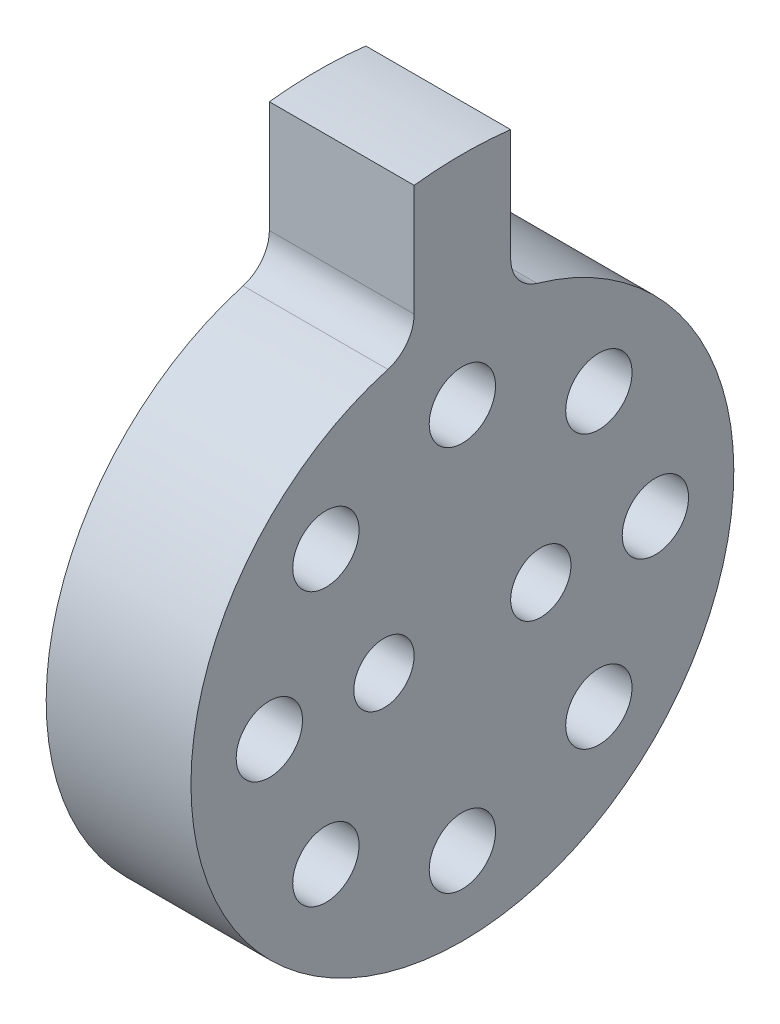
ISO-10303-21;
HEADER;
FILE_DESCRIPTION(('STEP AP214'),'2;1');
FILE_NAME('part.step','',(''),(''),'','','');
FILE_SCHEMA(('AUTOMOTIVE_DESIGN { 1 0 10303 214 1 1 1 1 }'));
ENDSEC;
DATA;
#1=APPLICATION_CONTEXT('core data for automotive mechanical design processes');
#2=APPLICATION_PROTOCOL_DEFINITION('international standard','automotive_design',2000,#1);
#3=PRODUCT_CONTEXT('',#1,'mechanical');
#4=PRODUCT('Part','Part','',(#3));
#5=PRODUCT_RELATED_PRODUCT_CATEGORY('part','',(#4));
#6=PRODUCT_DEFINITION_FORMATION('','',#4);
#7=PRODUCT_DEFINITION_CONTEXT('part definition',#1,'design');
#8=PRODUCT_DEFINITION('design','',#6,#7);
#9=PRODUCT_DEFINITION_SHAPE('','',#8);
#10=(LENGTH_UNIT() NAMED_UNIT(*) SI_UNIT(.MILLI.,.METRE.));
#11=(NAMED_UNIT(*) PLANE_ANGLE_UNIT() SI_UNIT($,.RADIAN.));
#12=(NAMED_UNIT(*) SI_UNIT($,.STERADIAN.) SOLID_ANGLE_UNIT());
#13=UNCERTAINTY_MEASURE_WITH_UNIT(LENGTH_MEASURE(1.E-05),#10,'distance_accuracy_value','');
#14=(GEOMETRIC_REPRESENTATION_CONTEXT(3) GLOBAL_UNCERTAINTY_ASSIGNED_CONTEXT((#13)) GLOBAL_UNIT_ASSIGNED_CONTEXT((#10,
#11,#12)) REPRESENTATION_CONTEXT('',''));
#15=CARTESIAN_POINT('',(0.,0.,0.));
#16=DIRECTION('',(0.,0.,1.));
#17=DIRECTION('',(1.,0.,0.));
#18=AXIS2_PLACEMENT_3D('',#15,#16,#17);
#19=CARTESIAN_POINT('',(12.,0.,0.));
#20=DIRECTION('',(-1.,0.,0.));
#21=DIRECTION('',(0.,0.,1.));
#22=AXIS2_PLACEMENT_3D('',#19,#20,#21);
#23=CYLINDRICAL_SURFACE('',#22,34.);
#24=DIRECTION('',(-1.,0.,0.));
#25=VECTOR('',#24,1.);
#26=CARTESIAN_POINT('',(12.,33.7638860322683,4.));
#27=LINE('',#26,#25);
#28=CARTESIAN_POINT('',(12.,33.7638860322683,4.));
#29=VERTEX_POINT('',#28);
#30=CARTESIAN_POINT('',(0.,33.7638860322683,4.));
#31=VERTEX_POINT('',#30);
#32=EDGE_CURVE('E103',#29,#31,#27,.T.);
#33=ORIENTED_EDGE('',*,*,#32,.F.);
#34=CARTESIAN_POINT('',(12.,0.,0.));
#35=DIRECTION('',(1.,0.,0.));
#36=DIRECTION('',(0.,0.,-1.));
#37=AXIS2_PLACEMENT_3D('',#34,#35,#36);
#38=CIRCLE('',#37,34.);
#39=CARTESIAN_POINT('',(12.,33.7638860322683,-4.));
#40=VERTEX_POINT('',#39);
#41=EDGE_CURVE('E109',#40,#29,#38,.T.);
#42=ORIENTED_EDGE('',*,*,#41,.F.);
#43=DIRECTION('',(-1.,0.,0.));
#44=VECTOR('',#43,1.);
#45=CARTESIAN_POINT('',(12.,33.7638860322683,-4.));
#46=LINE('',#45,#44);
#47=CARTESIAN_POINT('',(0.,33.7638860322683,-4.));
#48=VERTEX_POINT('',#47);
#49=EDGE_CURVE('E91',#40,#48,#46,.T.);
#50=ORIENTED_EDGE('',*,*,#49,.T.);
#51=CARTESIAN_POINT('',(0.,0.,0.));
#52=DIRECTION('',(1.,0.,0.));
#53=DIRECTION('',(0.,0.,-1.));
#54=AXIS2_PLACEMENT_3D('',#51,#52,#53);
#55=CIRCLE('',#54,34.);
#56=EDGE_CURVE('E119',#48,#31,#55,.T.);
#57=ORIENTED_EDGE('',*,*,#56,.T.);
#58=EDGE_LOOP('',(#33,#42,#50,#57));
#59=FACE_BOUND('',#58,.T.);
#60=ADVANCED_FACE('F40',(#59),#23,.T.);
#61=CARTESIAN_POINT('',(12.,0.,0.));
#62=DIRECTION('',(1.,0.,0.));
#63=DIRECTION('',(0.,0.,-1.));
#64=AXIS2_PLACEMENT_3D('',#61,#62,#63);
#65=PLANE('',#64);
#66=CARTESIAN_POINT('',(12.,0.,6.5));
#67=DIRECTION('',(-1.,0.,0.));
#68=DIRECTION('',(0.,0.,1.));
#69=AXIS2_PLACEMENT_3D('',#66,#67,#68);
#70=CIRCLE('',#69,2.5);
#71=CARTESIAN_POINT('',(12.,0.,9.));
#72=VERTEX_POINT('',#71);
#73=EDGE_CURVE('E282',#72,#72,#70,.T.);
#74=ORIENTED_EDGE('',*,*,#73,.T.);
#75=EDGE_LOOP('',(#74));
#76=FACE_BOUND('',#75,.T.);
#77=CARTESIAN_POINT('',(12.,0.,-6.5));
#78=DIRECTION('',(-1.,0.,0.));
#79=DIRECTION('',(0.,0.,1.));
#80=AXIS2_PLACEMENT_3D('',#77,#78,#79);
#81=CIRCLE('',#80,2.5);
#82=CARTESIAN_POINT('',(12.,0.,-4.));
#83=VERTEX_POINT('',#82);
#84=EDGE_CURVE('E277',#83,#83,#81,.T.);
#85=ORIENTED_EDGE('',*,*,#84,.T.);
#86=EDGE_LOOP('',(#85));
#87=FACE_BOUND('',#86,.T.);
#88=CARTESIAN_POINT('',(12.,16.,0.));
#89=DIRECTION('',(-1.,0.,0.));
#90=DIRECTION('',(0.,0.,1.));
#91=AXIS2_PLACEMENT_3D('',#88,#89,#90);
#92=CIRCLE('',#91,2.75);
#93=CARTESIAN_POINT('',(12.,16.,2.75));
#94=VERTEX_POINT('',#93);
#95=EDGE_CURVE('E123',#94,#94,#92,.T.);
#96=ORIENTED_EDGE('',*,*,#95,.T.);
#97=EDGE_LOOP('',(#96));
#98=FACE_BOUND('',#97,.T.);
#99=CARTESIAN_POINT('',(12.,11.3137084989847,-11.3137084989848));
#100=DIRECTION('',(-1.,0.,0.));
#101=DIRECTION('',(0.,0.,1.));
#102=AXIS2_PLACEMENT_3D('',#99,#100,#101);
#103=CIRCLE('',#102,2.75);
#104=CARTESIAN_POINT('',(12.,11.3137084989847,-8.56370849898478));
#105=VERTEX_POINT('',#104);
#106=EDGE_CURVE('E376',#105,#105,#103,.T.);
#107=ORIENTED_EDGE('',*,*,#106,.T.);
#108=EDGE_LOOP('',(#107));
#109=FACE_BOUND('',#108,.T.);
#110=CARTESIAN_POINT('',(12.,0.,-16.));
#111=DIRECTION('',(-1.,0.,0.));
#112=DIRECTION('',(0.,0.,1.));
#113=AXIS2_PLACEMENT_3D('',#110,#111,#112);
#114=CIRCLE('',#113,2.75);
#115=CARTESIAN_POINT('',(12.,0.,-13.25));
#116=VERTEX_POINT('',#115);
#117=EDGE_CURVE('E364',#116,#116,#114,.T.);
#118=ORIENTED_EDGE('',*,*,#117,.T.);
#119=EDGE_LOOP('',(#118));
#120=FACE_BOUND('',#119,.T.);
#121=CARTESIAN_POINT('',(12.,-11.3137084989848,-11.3137084989847));
#122=DIRECTION('',(-1.,0.,0.));
#123=DIRECTION('',(0.,0.,1.));
#124=AXIS2_PLACEMENT_3D('',#121,#122,#123);
#125=CIRCLE('',#124,2.75);
#126=CARTESIAN_POINT('',(12.,-11.3137084989848,-8.5637084989847));
#127=VERTEX_POINT('',#126);
#128=EDGE_CURVE('E352',#127,#127,#125,.T.);
#129=ORIENTED_EDGE('',*,*,#128,.T.);
#130=EDGE_LOOP('',(#129));
#131=FACE_BOUND('',#130,.T.);
#132=CARTESIAN_POINT('',(12.,-16.,0.));
#133=DIRECTION('',(-1.,0.,0.));
#134=DIRECTION('',(0.,0.,1.));
#135=AXIS2_PLACEMENT_3D('',#132,#133,#134);
#136=CIRCLE('',#135,2.75);
#137=CARTESIAN_POINT('',(12.,-16.,2.75));
#138=VERTEX_POINT('',#137);
#139=EDGE_CURVE('E340',#138,#138,#136,.T.);
#140=ORIENTED_EDGE('',*,*,#139,.T.);
#141=EDGE_LOOP('',(#140));
#142=FACE_BOUND('',#141,.T.);
#143=CARTESIAN_POINT('',(12.,-11.3137084989847,11.3137084989849));
#144=DIRECTION('',(-1.,0.,0.));
#145=DIRECTION('',(0.,0.,1.));
#146=AXIS2_PLACEMENT_3D('',#143,#144,#145);
#147=CIRCLE('',#146,2.75);
#148=CARTESIAN_POINT('',(12.,-11.3137084989847,14.0637084989849));
#149=VERTEX_POINT('',#148);
#150=EDGE_CURVE('E328',#149,#149,#147,.T.);
#151=ORIENTED_EDGE('',*,*,#150,.T.);
#152=EDGE_LOOP('',(#151));
#153=FACE_BOUND('',#152,.T.);
#154=CARTESIAN_POINT('',(12.,1.6759120133325E-13,16.));
#155=DIRECTION('',(-1.,0.,0.));
#156=DIRECTION('',(0.,0.,1.));
#157=AXIS2_PLACEMENT_3D('',#154,#155,#156);
#158=CIRCLE('',#157,2.75);
#159=CARTESIAN_POINT('',(12.,1.6759120133325E-13,18.75));
#160=VERTEX_POINT('',#159);
#161=EDGE_CURVE('E316',#160,#160,#158,.T.);
#162=ORIENTED_EDGE('',*,*,#161,.T.);
#163=EDGE_LOOP('',(#162));
#164=FACE_BOUND('',#163,.T.);
#165=CARTESIAN_POINT('',(12.,11.3137084989849,11.3137084989846));
#166=DIRECTION('',(-1.,0.,0.));
#167=DIRECTION('',(0.,0.,1.));
#168=AXIS2_PLACEMENT_3D('',#165,#166,#167);
#169=CIRCLE('',#168,2.75);
#170=CARTESIAN_POINT('',(12.,11.3137084989849,14.0637084989846));
#171=VERTEX_POINT('',#170);
#172=EDGE_CURVE('E304',#171,#171,#169,.T.);
#173=ORIENTED_EDGE('',*,*,#172,.T.);
#174=EDGE_LOOP('',(#173));
#175=FACE_BOUND('',#174,.T.);
#176=ORIENTED_EDGE('',*,*,#41,.T.);
#177=DIRECTION('',(0.,1.,0.));
#178=VECTOR('',#177,1.);
#179=CARTESIAN_POINT('',(12.,33.7638860322683,4.));
#180=LINE('',#179,#178);
#181=CARTESIAN_POINT('',(12.,24.5203996704785,4.));
#182=VERTEX_POINT('',#181);
#183=EDGE_CURVE('E104',#182,#29,#180,.T.);
#184=ORIENTED_EDGE('',*,*,#183,.F.);
#185=CARTESIAN_POINT('',(12.,24.5203996704785,7.));
#186=DIRECTION('',(1.,0.,0.));
#187=DIRECTION('',(0.,0.,-1.));
#188=AXIS2_PLACEMENT_3D('',#185,#186,#187);
#189=CIRCLE('',#188,3.);
#190=CARTESIAN_POINT('',(12.,21.6356467680692,6.17647058823529));
#191=VERTEX_POINT('',#190);
#192=EDGE_CURVE('E12',#182,#191,#189,.F.);
#193=ORIENTED_EDGE('',*,*,#192,.T.);
#194=CARTESIAN_POINT('',(12.,0.,0.));
#195=DIRECTION('',(-1.,0.,0.));
#196=DIRECTION('',(0.,0.,1.));
#197=AXIS2_PLACEMENT_3D('',#194,#195,#196);
#198=CIRCLE('',#197,22.5);
#199=CARTESIAN_POINT('',(12.,21.6356467680692,-6.17647058823529));
#200=VERTEX_POINT('',#199);
#201=EDGE_CURVE('E113',#200,#191,#198,.T.);
#202=ORIENTED_EDGE('',*,*,#201,.F.);
#203=CARTESIAN_POINT('',(12.,24.5203996704785,-7.));
#204=DIRECTION('',(1.,0.,0.));
#205=DIRECTION('',(0.,0.,-1.));
#206=AXIS2_PLACEMENT_3D('',#203,#204,#205);
#207=CIRCLE('',#206,3.);
#208=CARTESIAN_POINT('',(12.,24.5203996704785,-4.));
#209=VERTEX_POINT('',#208);
#210=EDGE_CURVE('E112',#200,#209,#207,.F.);
#211=ORIENTED_EDGE('',*,*,#210,.T.);
#212=DIRECTION('',(0.,-1.,0.));
#213=VECTOR('',#212,1.);
#214=CARTESIAN_POINT('',(12.,33.7638860322683,-4.));
#215=LINE('',#214,#213);
#216=EDGE_CURVE('E95',#40,#209,#215,.T.);
#217=ORIENTED_EDGE('',*,*,#216,.F.);
#218=EDGE_LOOP('',(#176,#184,#193,#202,#211,#217));
#219=FACE_BOUND('',#218,.T.);
#220=ADVANCED_FACE('F108',(#76,#87,#98,#109,#120,#131,#142,#153,#164,#175,#219),#65,.T.);
#221=CARTESIAN_POINT('',(0.,0.,0.));
#222=DIRECTION('',(1.,0.,0.));
#223=DIRECTION('',(0.,0.,-1.));
#224=AXIS2_PLACEMENT_3D('',#221,#222,#223);
#225=PLANE('',#224);
#226=CARTESIAN_POINT('',(0.,0.,6.5));
#227=DIRECTION('',(-1.,0.,0.));
#228=DIRECTION('',(0.,0.,1.));
#229=AXIS2_PLACEMENT_3D('',#226,#227,#228);
#230=CIRCLE('',#229,2.5);
#231=CARTESIAN_POINT('',(0.,0.,9.));
#232=VERTEX_POINT('',#231);
#233=EDGE_CURVE('E286',#232,#232,#230,.T.);
#234=ORIENTED_EDGE('',*,*,#233,.F.);
#235=EDGE_LOOP('',(#234));
#236=FACE_BOUND('',#235,.T.);
#237=CARTESIAN_POINT('',(0.,0.,-6.5));
#238=DIRECTION('',(-1.,0.,0.));
#239=DIRECTION('',(0.,0.,1.));
#240=AXIS2_PLACEMENT_3D('',#237,#238,#239);
#241=CIRCLE('',#240,2.5);
#242=CARTESIAN_POINT('',(0.,0.,-4.));
#243=VERTEX_POINT('',#242);
#244=EDGE_CURVE('E280',#243,#243,#241,.T.);
#245=ORIENTED_EDGE('',*,*,#244,.F.);
#246=EDGE_LOOP('',(#245));
#247=FACE_BOUND('',#246,.T.);
#248=CARTESIAN_POINT('',(0.,16.,0.));
#249=DIRECTION('',(-1.,0.,0.));
#250=DIRECTION('',(0.,0.,1.));
#251=AXIS2_PLACEMENT_3D('',#248,#249,#250);
#252=CIRCLE('',#251,5.);
#253=CARTESIAN_POINT('',(0.,16.,5.));
#254=VERTEX_POINT('',#253);
#255=EDGE_CURVE('E379',#254,#254,#252,.T.);
#256=ORIENTED_EDGE('',*,*,#255,.F.);
#257=EDGE_LOOP('',(#256));
#258=FACE_BOUND('',#257,.T.);
#259=CARTESIAN_POINT('',(0.,11.3137084989847,-11.3137084989848));
#260=DIRECTION('',(-1.,0.,0.));
#261=DIRECTION('',(0.,0.,1.));
#262=AXIS2_PLACEMENT_3D('',#259,#260,#261);
#263=CIRCLE('',#262,5.);
#264=CARTESIAN_POINT('',(0.,11.3137084989847,-6.31370849898478));
#265=VERTEX_POINT('',#264);
#266=EDGE_CURVE('E367',#265,#265,#263,.T.);
#267=ORIENTED_EDGE('',*,*,#266,.F.);
#268=EDGE_LOOP('',(#267));
#269=FACE_BOUND('',#268,.T.);
#270=CARTESIAN_POINT('',(0.,0.,-16.));
#271=DIRECTION('',(-1.,0.,0.));
#272=DIRECTION('',(0.,0.,1.));
#273=AXIS2_PLACEMENT_3D('',#270,#271,#272);
#274=CIRCLE('',#273,5.);
#275=CARTESIAN_POINT('',(0.,0.,-11.));
#276=VERTEX_POINT('',#275);
#277=EDGE_CURVE('E355',#276,#276,#274,.T.);
#278=ORIENTED_EDGE('',*,*,#277,.F.);
#279=EDGE_LOOP('',(#278));
#280=FACE_BOUND('',#279,.T.);
#281=CARTESIAN_POINT('',(0.,-11.3137084989848,-11.3137084989847));
#282=DIRECTION('',(-1.,0.,0.));
#283=DIRECTION('',(0.,0.,1.));
#284=AXIS2_PLACEMENT_3D('',#281,#282,#283);
#285=CIRCLE('',#284,5.);
#286=CARTESIAN_POINT('',(0.,-11.3137084989848,-6.3137084989847));
#287=VERTEX_POINT('',#286);
#288=EDGE_CURVE('E343',#287,#287,#285,.T.);
#289=ORIENTED_EDGE('',*,*,#288,.F.);
#290=EDGE_LOOP('',(#289));
#291=FACE_BOUND('',#290,.T.);
#292=CARTESIAN_POINT('',(0.,-16.,0.));
#293=DIRECTION('',(-1.,0.,0.));
#294=DIRECTION('',(0.,0.,1.));
#295=AXIS2_PLACEMENT_3D('',#292,#293,#294);
#296=CIRCLE('',#295,5.);
#297=CARTESIAN_POINT('',(0.,-16.,5.));
#298=VERTEX_POINT('',#297);
#299=EDGE_CURVE('E331',#298,#298,#296,.T.);
#300=ORIENTED_EDGE('',*,*,#299,.F.);
#301=EDGE_LOOP('',(#300));
#302=FACE_BOUND('',#301,.T.);
#303=CARTESIAN_POINT('',(0.,-11.3137084989847,11.3137084989849));
#304=DIRECTION('',(-1.,0.,0.));
#305=DIRECTION('',(0.,0.,1.));
#306=AXIS2_PLACEMENT_3D('',#303,#304,#305);
#307=CIRCLE('',#306,5.);
#308=CARTESIAN_POINT('',(0.,-11.3137084989847,16.3137084989849));
#309=VERTEX_POINT('',#308);
#310=EDGE_CURVE('E319',#309,#309,#307,.T.);
#311=ORIENTED_EDGE('',*,*,#310,.F.);
#312=EDGE_LOOP('',(#311));
#313=FACE_BOUND('',#312,.T.);
#314=CARTESIAN_POINT('',(0.,1.6759120133325E-13,16.));
#315=DIRECTION('',(-1.,0.,0.));
#316=DIRECTION('',(0.,0.,1.));
#317=AXIS2_PLACEMENT_3D('',#314,#315,#316);
#318=CIRCLE('',#317,5.);
#319=CARTESIAN_POINT('',(0.,1.6759120133325E-13,21.));
#320=VERTEX_POINT('',#319);
#321=EDGE_CURVE('E307',#320,#320,#318,.T.);
#322=ORIENTED_EDGE('',*,*,#321,.F.);
#323=EDGE_LOOP('',(#322));
#324=FACE_BOUND('',#323,.T.);
#325=CARTESIAN_POINT('',(0.,11.3137084989849,11.3137084989846));
#326=DIRECTION('',(-1.,0.,0.));
#327=DIRECTION('',(0.,0.,1.));
#328=AXIS2_PLACEMENT_3D('',#325,#326,#327);
#329=CIRCLE('',#328,5.);
#330=CARTESIAN_POINT('',(0.,11.3137084989849,16.3137084989846));
#331=VERTEX_POINT('',#330);
#332=EDGE_CURVE('E294',#331,#331,#329,.T.);
#333=ORIENTED_EDGE('',*,*,#332,.F.);
#334=EDGE_LOOP('',(#333));
#335=FACE_BOUND('',#334,.T.);
#336=CARTESIAN_POINT('',(0.,0.,0.));
#337=DIRECTION('',(-1.,0.,0.));
#338=DIRECTION('',(0.,0.,1.));
#339=AXIS2_PLACEMENT_3D('',#336,#337,#338);
#340=CIRCLE('',#339,22.5);
#341=CARTESIAN_POINT('',(0.,21.6356467680692,-6.17647058823529));
#342=VERTEX_POINT('',#341);
#343=CARTESIAN_POINT('',(0.,21.6356467680692,6.17647058823529));
#344=VERTEX_POINT('',#343);
#345=EDGE_CURVE('E137',#342,#344,#340,.T.);
#346=ORIENTED_EDGE('',*,*,#345,.T.);
#347=CARTESIAN_POINT('',(0.,24.5203996704785,7.));
#348=DIRECTION('',(1.,0.,0.));
#349=DIRECTION('',(0.,0.,-1.));
#350=AXIS2_PLACEMENT_3D('',#347,#348,#349);
#351=CIRCLE('',#350,3.);
#352=CARTESIAN_POINT('',(0.,24.5203996704785,4.));
#353=VERTEX_POINT('',#352);
#354=EDGE_CURVE('E48',#344,#353,#351,.T.);
#355=ORIENTED_EDGE('',*,*,#354,.T.);
#356=DIRECTION('',(0.,1.,0.));
#357=VECTOR('',#356,1.);
#358=CARTESIAN_POINT('',(0.,33.7638860322683,4.));
#359=LINE('',#358,#357);
#360=EDGE_CURVE('E114',#353,#31,#359,.T.);
#361=ORIENTED_EDGE('',*,*,#360,.T.);
#362=ORIENTED_EDGE('',*,*,#56,.F.);
#363=DIRECTION('',(0.,-1.,0.));
#364=VECTOR('',#363,1.);
#365=CARTESIAN_POINT('',(0.,33.7638860322683,-4.));
#366=LINE('',#365,#364);
#367=CARTESIAN_POINT('',(0.,24.5203996704785,-4.));
#368=VERTEX_POINT('',#367);
#369=EDGE_CURVE('E98',#48,#368,#366,.T.);
#370=ORIENTED_EDGE('',*,*,#369,.T.);
#371=CARTESIAN_POINT('',(0.,24.5203996704785,-7.));
#372=DIRECTION('',(1.,0.,0.));
#373=DIRECTION('',(0.,0.,-1.));
#374=AXIS2_PLACEMENT_3D('',#371,#372,#373);
#375=CIRCLE('',#374,3.);
#376=EDGE_CURVE('E133',#368,#342,#375,.T.);
#377=ORIENTED_EDGE('',*,*,#376,.T.);
#378=EDGE_LOOP('',(#346,#355,#361,#362,#370,#377));
#379=FACE_BOUND('',#378,.T.);
#380=ADVANCED_FACE('F136',(#236,#247,#258,#269,#280,#291,#302,#313,#324,#335,#379),#225,.F.);
#381=CARTESIAN_POINT('',(0.,16.,0.));
#382=DIRECTION('',(-1.,0.,0.));
#383=DIRECTION('',(0.,0.,1.));
#384=AXIS2_PLACEMENT_3D('',#381,#382,#383);
#385=CYLINDRICAL_SURFACE('',#384,2.75);
#386=ORIENTED_EDGE('',*,*,#95,.F.);
#387=EDGE_LOOP('',(#386));
#388=FACE_BOUND('',#387,.T.);
#389=CARTESIAN_POINT('',(5.7,16.,0.));
#390=DIRECTION('',(-1.,0.,0.));
#391=DIRECTION('',(0.,0.,1.));
#392=AXIS2_PLACEMENT_3D('',#389,#390,#391);
#393=CIRCLE('',#392,2.75);
#394=CARTESIAN_POINT('',(5.7,16.,2.75));
#395=VERTEX_POINT('',#394);
#396=EDGE_CURVE('E384',#395,#395,#393,.T.);
#397=ORIENTED_EDGE('',*,*,#396,.T.);
#398=EDGE_LOOP('',(#397));
#399=FACE_BOUND('',#398,.T.);
#400=ADVANCED_FACE('F165',(#388,#399),#385,.F.);
#401=CARTESIAN_POINT('',(5.7,18.75,0.));
#402=DIRECTION('',(1.,0.,0.));
#403=DIRECTION('',(0.,0.,-1.));
#404=AXIS2_PLACEMENT_3D('',#401,#402,#403);
#405=PLANE('',#404);
#406=ORIENTED_EDGE('',*,*,#396,.F.);
#407=EDGE_LOOP('',(#406));
#408=FACE_BOUND('',#407,.T.);
#409=CARTESIAN_POINT('',(5.7,16.,0.));
#410=DIRECTION('',(-1.,0.,0.));
#411=DIRECTION('',(0.,0.,1.));
#412=AXIS2_PLACEMENT_3D('',#409,#410,#411);
#413=CIRCLE('',#412,5.);
#414=CARTESIAN_POINT('',(5.7,16.,5.));
#415=VERTEX_POINT('',#414);
#416=EDGE_CURVE('E382',#415,#415,#413,.T.);
#417=ORIENTED_EDGE('',*,*,#416,.T.);
#418=EDGE_LOOP('',(#417));
#419=FACE_BOUND('',#418,.T.);
#420=ADVANCED_FACE('F170',(#408,#419),#405,.F.);
#421=CARTESIAN_POINT('',(0.,16.,0.));
#422=DIRECTION('',(-1.,0.,0.));
#423=DIRECTION('',(0.,0.,1.));
#424=AXIS2_PLACEMENT_3D('',#421,#422,#423);
#425=CYLINDRICAL_SURFACE('',#424,5.);
#426=ORIENTED_EDGE('',*,*,#416,.F.);
#427=EDGE_LOOP('',(#426));
#428=FACE_BOUND('',#427,.T.);
#429=ORIENTED_EDGE('',*,*,#255,.T.);
#430=EDGE_LOOP('',(#429));
#431=FACE_BOUND('',#430,.T.);
#432=ADVANCED_FACE('F174',(#428,#431),#425,.F.);
#433=CARTESIAN_POINT('',(0.,11.3137084989847,-11.3137084989848));
#434=DIRECTION('',(-1.,0.,0.));
#435=DIRECTION('',(0.,0.,1.));
#436=AXIS2_PLACEMENT_3D('',#433,#434,#435);
#437=CYLINDRICAL_SURFACE('',#436,2.75);
#438=ORIENTED_EDGE('',*,*,#106,.F.);
#439=EDGE_LOOP('',(#438));
#440=FACE_BOUND('',#439,.T.);
#441=CARTESIAN_POINT('',(5.7,11.3137084989847,-11.3137084989848));
#442=DIRECTION('',(-1.,0.,0.));
#443=DIRECTION('',(0.,0.,1.));
#444=AXIS2_PLACEMENT_3D('',#441,#442,#443);
#445=CIRCLE('',#444,2.75);
#446=CARTESIAN_POINT('',(5.7,11.3137084989847,-8.56370849898478));
#447=VERTEX_POINT('',#446);
#448=EDGE_CURVE('E373',#447,#447,#445,.T.);
#449=ORIENTED_EDGE('',*,*,#448,.T.);
#450=EDGE_LOOP('',(#449));
#451=FACE_BOUND('',#450,.T.);
#452=ADVANCED_FACE('F178',(#440,#451),#437,.F.);
#453=CARTESIAN_POINT('',(5.7,14.0637084989847,-11.3137084989848));
#454=DIRECTION('',(1.,0.,0.));
#455=DIRECTION('',(0.,0.,-1.));
#456=AXIS2_PLACEMENT_3D('',#453,#454,#455);
#457=PLANE('',#456);
#458=ORIENTED_EDGE('',*,*,#448,.F.);
#459=EDGE_LOOP('',(#458));
#460=FACE_BOUND('',#459,.T.);
#461=CARTESIAN_POINT('',(5.7,11.3137084989847,-11.3137084989848));
#462=DIRECTION('',(-1.,0.,0.));
#463=DIRECTION('',(0.,0.,1.));
#464=AXIS2_PLACEMENT_3D('',#461,#462,#463);
#465=CIRCLE('',#464,5.);
#466=CARTESIAN_POINT('',(5.7,11.3137084989847,-6.31370849898478));
#467=VERTEX_POINT('',#466);
#468=EDGE_CURVE('E370',#467,#467,#465,.T.);
#469=ORIENTED_EDGE('',*,*,#468,.T.);
#470=EDGE_LOOP('',(#469));
#471=FACE_BOUND('',#470,.T.);
#472=ADVANCED_FACE('F182',(#460,#471),#457,.F.);
#473=CARTESIAN_POINT('',(0.,11.3137084989847,-11.3137084989848));
#474=DIRECTION('',(-1.,0.,0.));
#475=DIRECTION('',(0.,0.,1.));
#476=AXIS2_PLACEMENT_3D('',#473,#474,#475);
#477=CYLINDRICAL_SURFACE('',#476,5.);
#478=ORIENTED_EDGE('',*,*,#468,.F.);
#479=EDGE_LOOP('',(#478));
#480=FACE_BOUND('',#479,.T.);
#481=ORIENTED_EDGE('',*,*,#266,.T.);
#482=EDGE_LOOP('',(#481));
#483=FACE_BOUND('',#482,.T.);
#484=ADVANCED_FACE('F186',(#480,#483),#477,.F.);
#485=CARTESIAN_POINT('',(0.,0.,-16.));
#486=DIRECTION('',(-1.,0.,0.));
#487=DIRECTION('',(0.,0.,1.));
#488=AXIS2_PLACEMENT_3D('',#485,#486,#487);
#489=CYLINDRICAL_SURFACE('',#488,2.75);
#490=ORIENTED_EDGE('',*,*,#117,.F.);
#491=EDGE_LOOP('',(#490));
#492=FACE_BOUND('',#491,.T.);
#493=CARTESIAN_POINT('',(5.7,0.,-16.));
#494=DIRECTION('',(-1.,0.,0.));
#495=DIRECTION('',(0.,0.,1.));
#496=AXIS2_PLACEMENT_3D('',#493,#494,#495);
#497=CIRCLE('',#496,2.75);
#498=CARTESIAN_POINT('',(5.7,0.,-13.25));
#499=VERTEX_POINT('',#498);
#500=EDGE_CURVE('E361',#499,#499,#497,.T.);
#501=ORIENTED_EDGE('',*,*,#500,.T.);
#502=EDGE_LOOP('',(#501));
#503=FACE_BOUND('',#502,.T.);
#504=ADVANCED_FACE('F190',(#492,#503),#489,.F.);
#505=CARTESIAN_POINT('',(5.7,2.74999999999994,-16.));
#506=DIRECTION('',(1.,0.,0.));
#507=DIRECTION('',(0.,0.,-1.));
#508=AXIS2_PLACEMENT_3D('',#505,#506,#507);
#509=PLANE('',#508);
#510=ORIENTED_EDGE('',*,*,#500,.F.);
#511=EDGE_LOOP('',(#510));
#512=FACE_BOUND('',#511,.T.);
#513=CARTESIAN_POINT('',(5.7,0.,-16.));
#514=DIRECTION('',(-1.,0.,0.));
#515=DIRECTION('',(0.,0.,1.));
#516=AXIS2_PLACEMENT_3D('',#513,#514,#515);
#517=CIRCLE('',#516,5.);
#518=CARTESIAN_POINT('',(5.7,0.,-11.));
#519=VERTEX_POINT('',#518);
#520=EDGE_CURVE('E358',#519,#519,#517,.T.);
#521=ORIENTED_EDGE('',*,*,#520,.T.);
#522=EDGE_LOOP('',(#521));
#523=FACE_BOUND('',#522,.T.);
#524=ADVANCED_FACE('F194',(#512,#523),#509,.F.);
#525=CARTESIAN_POINT('',(0.,0.,-16.));
#526=DIRECTION('',(-1.,0.,0.));
#527=DIRECTION('',(0.,0.,1.));
#528=AXIS2_PLACEMENT_3D('',#525,#526,#527);
#529=CYLINDRICAL_SURFACE('',#528,5.);
#530=ORIENTED_EDGE('',*,*,#520,.F.);
#531=EDGE_LOOP('',(#530));
#532=FACE_BOUND('',#531,.T.);
#533=ORIENTED_EDGE('',*,*,#277,.T.);
#534=EDGE_LOOP('',(#533));
#535=FACE_BOUND('',#534,.T.);
#536=ADVANCED_FACE('F198',(#532,#535),#529,.F.);
#537=CARTESIAN_POINT('',(0.,-11.3137084989848,-11.3137084989847));
#538=DIRECTION('',(-1.,0.,0.));
#539=DIRECTION('',(0.,0.,1.));
#540=AXIS2_PLACEMENT_3D('',#537,#538,#539);
#541=CYLINDRICAL_SURFACE('',#540,2.75);
#542=ORIENTED_EDGE('',*,*,#128,.F.);
#543=EDGE_LOOP('',(#542));
#544=FACE_BOUND('',#543,.T.);
#545=CARTESIAN_POINT('',(5.7,-11.3137084989848,-11.3137084989847));
#546=DIRECTION('',(-1.,0.,0.));
#547=DIRECTION('',(0.,0.,1.));
#548=AXIS2_PLACEMENT_3D('',#545,#546,#547);
#549=CIRCLE('',#548,2.75);
#550=CARTESIAN_POINT('',(5.7,-11.3137084989848,-8.5637084989847));
#551=VERTEX_POINT('',#550);
#552=EDGE_CURVE('E349',#551,#551,#549,.T.);
#553=ORIENTED_EDGE('',*,*,#552,.T.);
#554=EDGE_LOOP('',(#553));
#555=FACE_BOUND('',#554,.T.);
#556=ADVANCED_FACE('F202',(#544,#555),#541,.F.);
#557=CARTESIAN_POINT('',(5.7,-8.56370849898482,-11.3137084989847));
#558=DIRECTION('',(1.,0.,0.));
#559=DIRECTION('',(0.,0.,-1.));
#560=AXIS2_PLACEMENT_3D('',#557,#558,#559);
#561=PLANE('',#560);
#562=ORIENTED_EDGE('',*,*,#552,.F.);
#563=EDGE_LOOP('',(#562));
#564=FACE_BOUND('',#563,.T.);
#565=CARTESIAN_POINT('',(5.7,-11.3137084989848,-11.3137084989847));
#566=DIRECTION('',(-1.,0.,0.));
#567=DIRECTION('',(0.,0.,1.));
#568=AXIS2_PLACEMENT_3D('',#565,#566,#567);
#569=CIRCLE('',#568,5.);
#570=CARTESIAN_POINT('',(5.7,-11.3137084989848,-6.3137084989847));
#571=VERTEX_POINT('',#570);
#572=EDGE_CURVE('E346',#571,#571,#569,.T.);
#573=ORIENTED_EDGE('',*,*,#572,.T.);
#574=EDGE_LOOP('',(#573));
#575=FACE_BOUND('',#574,.T.);
#576=ADVANCED_FACE('F206',(#564,#575),#561,.F.);
#577=CARTESIAN_POINT('',(0.,-11.3137084989848,-11.3137084989847));
#578=DIRECTION('',(-1.,0.,0.));
#579=DIRECTION('',(0.,0.,1.));
#580=AXIS2_PLACEMENT_3D('',#577,#578,#579);
#581=CYLINDRICAL_SURFACE('',#580,5.);
#582=ORIENTED_EDGE('',*,*,#572,.F.);
#583=EDGE_LOOP('',(#582));
#584=FACE_BOUND('',#583,.T.);
#585=ORIENTED_EDGE('',*,*,#288,.T.);
#586=EDGE_LOOP('',(#585));
#587=FACE_BOUND('',#586,.T.);
#588=ADVANCED_FACE('F210',(#584,#587),#581,.F.);
#589=CARTESIAN_POINT('',(0.,-16.,0.));
#590=DIRECTION('',(-1.,0.,0.));
#591=DIRECTION('',(0.,0.,1.));
#592=AXIS2_PLACEMENT_3D('',#589,#590,#591);
#593=CYLINDRICAL_SURFACE('',#592,2.75);
#594=ORIENTED_EDGE('',*,*,#139,.F.);
#595=EDGE_LOOP('',(#594));
#596=FACE_BOUND('',#595,.T.);
#597=CARTESIAN_POINT('',(5.7,-16.,0.));
#598=DIRECTION('',(-1.,0.,0.));
#599=DIRECTION('',(0.,0.,1.));
#600=AXIS2_PLACEMENT_3D('',#597,#598,#599);
#601=CIRCLE('',#600,2.75);
#602=CARTESIAN_POINT('',(5.7,-16.,2.75));
#603=VERTEX_POINT('',#602);
#604=EDGE_CURVE('E337',#603,#603,#601,.T.);
#605=ORIENTED_EDGE('',*,*,#604,.T.);
#606=EDGE_LOOP('',(#605));
#607=FACE_BOUND('',#606,.T.);
#608=ADVANCED_FACE('F214',(#596,#607),#593,.F.);
#609=CARTESIAN_POINT('',(5.7,-13.25,0.));
#610=DIRECTION('',(1.,0.,0.));
#611=DIRECTION('',(0.,0.,-1.));
#612=AXIS2_PLACEMENT_3D('',#609,#610,#611);
#613=PLANE('',#612);
#614=ORIENTED_EDGE('',*,*,#604,.F.);
#615=EDGE_LOOP('',(#614));
#616=FACE_BOUND('',#615,.T.);
#617=CARTESIAN_POINT('',(5.7,-16.,0.));
#618=DIRECTION('',(-1.,0.,0.));
#619=DIRECTION('',(0.,0.,1.));
#620=AXIS2_PLACEMENT_3D('',#617,#618,#619);
#621=CIRCLE('',#620,5.);
#622=CARTESIAN_POINT('',(5.7,-16.,5.));
#623=VERTEX_POINT('',#622);
#624=EDGE_CURVE('E334',#623,#623,#621,.T.);
#625=ORIENTED_EDGE('',*,*,#624,.T.);
#626=EDGE_LOOP('',(#625));
#627=FACE_BOUND('',#626,.T.);
#628=ADVANCED_FACE('F218',(#616,#627),#613,.F.);
#629=CARTESIAN_POINT('',(0.,-16.,0.));
#630=DIRECTION('',(-1.,0.,0.));
#631=DIRECTION('',(0.,0.,1.));
#632=AXIS2_PLACEMENT_3D('',#629,#630,#631);
#633=CYLINDRICAL_SURFACE('',#632,5.);
#634=ORIENTED_EDGE('',*,*,#624,.F.);
#635=EDGE_LOOP('',(#634));
#636=FACE_BOUND('',#635,.T.);
#637=ORIENTED_EDGE('',*,*,#299,.T.);
#638=EDGE_LOOP('',(#637));
#639=FACE_BOUND('',#638,.T.);
#640=ADVANCED_FACE('F222',(#636,#639),#633,.F.);
#641=CARTESIAN_POINT('',(0.,-11.3137084989847,11.3137084989849));
#642=DIRECTION('',(-1.,0.,0.));
#643=DIRECTION('',(0.,0.,1.));
#644=AXIS2_PLACEMENT_3D('',#641,#642,#643);
#645=CYLINDRICAL_SURFACE('',#644,2.75);
#646=ORIENTED_EDGE('',*,*,#150,.F.);
#647=EDGE_LOOP('',(#646));
#648=FACE_BOUND('',#647,.T.);
#649=CARTESIAN_POINT('',(5.7,-11.3137084989847,11.3137084989849));
#650=DIRECTION('',(-1.,0.,0.));
#651=DIRECTION('',(0.,0.,1.));
#652=AXIS2_PLACEMENT_3D('',#649,#650,#651);
#653=CIRCLE('',#652,2.75);
#654=CARTESIAN_POINT('',(5.7,-11.3137084989847,14.0637084989849));
#655=VERTEX_POINT('',#654);
#656=EDGE_CURVE('E325',#655,#655,#653,.T.);
#657=ORIENTED_EDGE('',*,*,#656,.T.);
#658=EDGE_LOOP('',(#657));
#659=FACE_BOUND('',#658,.T.);
#660=ADVANCED_FACE('F226',(#648,#659),#645,.F.);
#661=CARTESIAN_POINT('',(5.7,-8.56370849898466,11.3137084989849));
#662=DIRECTION('',(1.,0.,0.));
#663=DIRECTION('',(0.,0.,-1.));
#664=AXIS2_PLACEMENT_3D('',#661,#662,#663);
#665=PLANE('',#664);
#666=ORIENTED_EDGE('',*,*,#656,.F.);
#667=EDGE_LOOP('',(#666));
#668=FACE_BOUND('',#667,.T.);
#669=CARTESIAN_POINT('',(5.7,-11.3137084989847,11.3137084989849));
#670=DIRECTION('',(-1.,0.,0.));
#671=DIRECTION('',(0.,0.,1.));
#672=AXIS2_PLACEMENT_3D('',#669,#670,#671);
#673=CIRCLE('',#672,5.);
#674=CARTESIAN_POINT('',(5.7,-11.3137084989847,16.3137084989849));
#675=VERTEX_POINT('',#674);
#676=EDGE_CURVE('E322',#675,#675,#673,.T.);
#677=ORIENTED_EDGE('',*,*,#676,.T.);
#678=EDGE_LOOP('',(#677));
#679=FACE_BOUND('',#678,.T.);
#680=ADVANCED_FACE('F230',(#668,#679),#665,.F.);
#681=CARTESIAN_POINT('',(0.,-11.3137084989847,11.3137084989849));
#682=DIRECTION('',(-1.,0.,0.));
#683=DIRECTION('',(0.,0.,1.));
#684=AXIS2_PLACEMENT_3D('',#681,#682,#683);
#685=CYLINDRICAL_SURFACE('',#684,5.);
#686=ORIENTED_EDGE('',*,*,#676,.F.);
#687=EDGE_LOOP('',(#686));
#688=FACE_BOUND('',#687,.T.);
#689=ORIENTED_EDGE('',*,*,#310,.T.);
#690=EDGE_LOOP('',(#689));
#691=FACE_BOUND('',#690,.T.);
#692=ADVANCED_FACE('F234',(#688,#691),#685,.F.);
#693=CARTESIAN_POINT('',(0.,1.6759120133325E-13,16.));
#694=DIRECTION('',(-1.,0.,0.));
#695=DIRECTION('',(0.,0.,1.));
#696=AXIS2_PLACEMENT_3D('',#693,#694,#695);
#697=CYLINDRICAL_SURFACE('',#696,2.75);
#698=ORIENTED_EDGE('',*,*,#161,.F.);
#699=EDGE_LOOP('',(#698));
#700=FACE_BOUND('',#699,.T.);
#701=CARTESIAN_POINT('',(5.7,1.6759120133325E-13,16.));
#702=DIRECTION('',(-1.,0.,0.));
#703=DIRECTION('',(0.,0.,1.));
#704=AXIS2_PLACEMENT_3D('',#701,#702,#703);
#705=CIRCLE('',#704,2.75);
#706=CARTESIAN_POINT('',(5.7,1.6759120133325E-13,18.75));
#707=VERTEX_POINT('',#706);
#708=EDGE_CURVE('E313',#707,#707,#705,.T.);
#709=ORIENTED_EDGE('',*,*,#708,.T.);
#710=EDGE_LOOP('',(#709));
#711=FACE_BOUND('',#710,.T.);
#712=ADVANCED_FACE('F238',(#700,#711),#697,.F.);
#713=CARTESIAN_POINT('',(5.7,2.75000000000017,16.));
#714=DIRECTION('',(1.,0.,0.));
#715=DIRECTION('',(0.,0.,-1.));
#716=AXIS2_PLACEMENT_3D('',#713,#714,#715);
#717=PLANE('',#716);
#718=ORIENTED_EDGE('',*,*,#708,.F.);
#719=EDGE_LOOP('',(#718));
#720=FACE_BOUND('',#719,.T.);
#721=CARTESIAN_POINT('',(5.7,1.6759120133325E-13,16.));
#722=DIRECTION('',(-1.,0.,0.));
#723=DIRECTION('',(0.,0.,1.));
#724=AXIS2_PLACEMENT_3D('',#721,#722,#723);
#725=CIRCLE('',#724,5.);
#726=CARTESIAN_POINT('',(5.7,1.6759120133325E-13,21.));
#727=VERTEX_POINT('',#726);
#728=EDGE_CURVE('E310',#727,#727,#725,.T.);
#729=ORIENTED_EDGE('',*,*,#728,.T.);
#730=EDGE_LOOP('',(#729));
#731=FACE_BOUND('',#730,.T.);
#732=ADVANCED_FACE('F242',(#720,#731),#717,.F.);
#733=CARTESIAN_POINT('',(0.,1.6759120133325E-13,16.));
#734=DIRECTION('',(-1.,0.,0.));
#735=DIRECTION('',(0.,0.,1.));
#736=AXIS2_PLACEMENT_3D('',#733,#734,#735);
#737=CYLINDRICAL_SURFACE('',#736,5.);
#738=ORIENTED_EDGE('',*,*,#728,.F.);
#739=EDGE_LOOP('',(#738));
#740=FACE_BOUND('',#739,.T.);
#741=ORIENTED_EDGE('',*,*,#321,.T.);
#742=EDGE_LOOP('',(#741));
#743=FACE_BOUND('',#742,.T.);
#744=ADVANCED_FACE('F246',(#740,#743),#737,.F.);
#745=CARTESIAN_POINT('',(0.,11.3137084989849,11.3137084989846));
#746=DIRECTION('',(-1.,0.,0.));
#747=DIRECTION('',(0.,0.,1.));
#748=AXIS2_PLACEMENT_3D('',#745,#746,#747);
#749=CYLINDRICAL_SURFACE('',#748,2.75);
#750=ORIENTED_EDGE('',*,*,#172,.F.);
#751=EDGE_LOOP('',(#750));
#752=FACE_BOUND('',#751,.T.);
#753=CARTESIAN_POINT('',(5.7,11.3137084989849,11.3137084989846));
#754=DIRECTION('',(-1.,0.,0.));
#755=DIRECTION('',(0.,0.,1.));
#756=AXIS2_PLACEMENT_3D('',#753,#754,#755);
#757=CIRCLE('',#756,2.75);
#758=CARTESIAN_POINT('',(5.7,11.3137084989849,14.0637084989846));
#759=VERTEX_POINT('',#758);
#760=EDGE_CURVE('E301',#759,#759,#757,.T.);
#761=ORIENTED_EDGE('',*,*,#760,.T.);
#762=EDGE_LOOP('',(#761));
#763=FACE_BOUND('',#762,.T.);
#764=ADVANCED_FACE('F250',(#752,#763),#749,.F.);
#765=CARTESIAN_POINT('',(5.7,14.0637084989849,11.3137084989846));
#766=DIRECTION('',(1.,0.,0.));
#767=DIRECTION('',(0.,0.,-1.));
#768=AXIS2_PLACEMENT_3D('',#765,#766,#767);
#769=PLANE('',#768);
#770=ORIENTED_EDGE('',*,*,#760,.F.);
#771=EDGE_LOOP('',(#770));
#772=FACE_BOUND('',#771,.T.);
#773=CARTESIAN_POINT('',(5.7,11.3137084989849,11.3137084989846));
#774=DIRECTION('',(-1.,0.,0.));
#775=DIRECTION('',(0.,0.,1.));
#776=AXIS2_PLACEMENT_3D('',#773,#774,#775);
#777=CIRCLE('',#776,5.);
#778=CARTESIAN_POINT('',(5.7,11.3137084989849,16.3137084989846));
#779=VERTEX_POINT('',#778);
#780=EDGE_CURVE('E298',#779,#779,#777,.T.);
#781=ORIENTED_EDGE('',*,*,#780,.T.);
#782=EDGE_LOOP('',(#781));
#783=FACE_BOUND('',#782,.T.);
#784=ADVANCED_FACE('F254',(#772,#783),#769,.F.);
#785=CARTESIAN_POINT('',(0.,11.3137084989849,11.3137084989846));
#786=DIRECTION('',(-1.,0.,0.));
#787=DIRECTION('',(0.,0.,1.));
#788=AXIS2_PLACEMENT_3D('',#785,#786,#787);
#789=CYLINDRICAL_SURFACE('',#788,5.);
#790=ORIENTED_EDGE('',*,*,#780,.F.);
#791=EDGE_LOOP('',(#790));
#792=FACE_BOUND('',#791,.T.);
#793=ORIENTED_EDGE('',*,*,#332,.T.);
#794=EDGE_LOOP('',(#793));
#795=FACE_BOUND('',#794,.T.);
#796=ADVANCED_FACE('F258',(#792,#795),#789,.F.);
#797=CARTESIAN_POINT('',(12.,33.7638860322683,4.));
#798=DIRECTION('',(0.,0.,1.));
#799=DIRECTION('',(1.,0.,0.));
#800=AXIS2_PLACEMENT_3D('',#797,#798,#799);
#801=PLANE('',#800);
#802=ORIENTED_EDGE('',*,*,#360,.F.);
#803=DIRECTION('',(1.,0.,0.));
#804=VECTOR('',#803,1.);
#805=CARTESIAN_POINT('',(12.,24.5203996704785,4.));
#806=LINE('',#805,#804);
#807=EDGE_CURVE('E55',#353,#182,#806,.T.);
#808=ORIENTED_EDGE('',*,*,#807,.T.);
#809=ORIENTED_EDGE('',*,*,#183,.T.);
#810=ORIENTED_EDGE('',*,*,#32,.T.);
#811=EDGE_LOOP('',(#802,#808,#809,#810));
#812=FACE_BOUND('',#811,.T.);
#813=ADVANCED_FACE('F262',(#812),#801,.T.);
#814=CARTESIAN_POINT('',(12.,0.,0.));
#815=DIRECTION('',(-1.,0.,0.));
#816=DIRECTION('',(0.,0.,1.));
#817=AXIS2_PLACEMENT_3D('',#814,#815,#816);
#818=CYLINDRICAL_SURFACE('',#817,22.5);
#819=ORIENTED_EDGE('',*,*,#345,.F.);
#820=DIRECTION('',(-1.,0.,0.));
#821=VECTOR('',#820,1.);
#822=CARTESIAN_POINT('',(12.,21.6356467680692,-6.17647058823529));
#823=LINE('',#822,#821);
#824=EDGE_CURVE('E130',#342,#200,#823,.F.);
#825=ORIENTED_EDGE('',*,*,#824,.T.);
#826=ORIENTED_EDGE('',*,*,#201,.T.);
#827=DIRECTION('',(-1.,0.,0.));
#828=VECTOR('',#827,1.);
#829=CARTESIAN_POINT('',(12.,21.6356467680692,6.17647058823529));
#830=LINE('',#829,#828);
#831=EDGE_CURVE('E121',#191,#344,#830,.T.);
#832=ORIENTED_EDGE('',*,*,#831,.T.);
#833=EDGE_LOOP('',(#819,#825,#826,#832));
#834=FACE_BOUND('',#833,.T.);
#835=ADVANCED_FACE('F141',(#834),#818,.T.);
#836=CARTESIAN_POINT('',(12.,33.7638860322683,-4.));
#837=DIRECTION('',(0.,0.,-1.));
#838=DIRECTION('',(-1.,0.,0.));
#839=AXIS2_PLACEMENT_3D('',#836,#837,#838);
#840=PLANE('',#839);
#841=ORIENTED_EDGE('',*,*,#216,.T.);
#842=DIRECTION('',(1.,0.,0.));
#843=VECTOR('',#842,1.);
#844=CARTESIAN_POINT('',(0.,24.5203996704785,-4.));
#845=LINE('',#844,#843);
#846=EDGE_CURVE('E118',#209,#368,#845,.F.);
#847=ORIENTED_EDGE('',*,*,#846,.T.);
#848=ORIENTED_EDGE('',*,*,#369,.F.);
#849=ORIENTED_EDGE('',*,*,#49,.F.);
#850=EDGE_LOOP('',(#841,#847,#848,#849));
#851=FACE_BOUND('',#850,.T.);
#852=ADVANCED_FACE('F93',(#851),#840,.T.);
#853=CARTESIAN_POINT('',(0.,0.,-6.5));
#854=DIRECTION('',(-1.,0.,0.));
#855=DIRECTION('',(0.,0.,1.));
#856=AXIS2_PLACEMENT_3D('',#853,#854,#855);
#857=CYLINDRICAL_SURFACE('',#856,2.5);
#858=ORIENTED_EDGE('',*,*,#84,.F.);
#859=EDGE_LOOP('',(#858));
#860=FACE_BOUND('',#859,.T.);
#861=ORIENTED_EDGE('',*,*,#244,.T.);
#862=EDGE_LOOP('',(#861));
#863=FACE_BOUND('',#862,.T.);
#864=ADVANCED_FACE('F153',(#860,#863),#857,.F.);
#865=CARTESIAN_POINT('',(0.,0.,6.5));
#866=DIRECTION('',(-1.,0.,0.));
#867=DIRECTION('',(0.,0.,1.));
#868=AXIS2_PLACEMENT_3D('',#865,#866,#867);
#869=CYLINDRICAL_SURFACE('',#868,2.5);
#870=ORIENTED_EDGE('',*,*,#73,.F.);
#871=EDGE_LOOP('',(#870));
#872=FACE_BOUND('',#871,.T.);
#873=ORIENTED_EDGE('',*,*,#233,.T.);
#874=EDGE_LOOP('',(#873));
#875=FACE_BOUND('',#874,.T.);
#876=ADVANCED_FACE('F147',(#872,#875),#869,.F.);
#877=CARTESIAN_POINT('',(12.,24.5203996704785,-7.));
#878=DIRECTION('',(-1.,0.,0.));
#879=DIRECTION('',(0.,0.,1.));
#880=AXIS2_PLACEMENT_3D('',#877,#878,#879);
#881=CYLINDRICAL_SURFACE('',#880,3.);
#882=ORIENTED_EDGE('',*,*,#210,.F.);
#883=ORIENTED_EDGE('',*,*,#824,.F.);
#884=ORIENTED_EDGE('',*,*,#376,.F.);
#885=ORIENTED_EDGE('',*,*,#846,.F.);
#886=EDGE_LOOP('',(#882,#883,#884,#885));
#887=FACE_BOUND('',#886,.T.);
#888=ADVANCED_FACE('F145',(#887),#881,.F.);
#889=CARTESIAN_POINT('',(12.,24.5203996704785,7.));
#890=DIRECTION('',(-1.,0.,0.));
#891=DIRECTION('',(0.,0.,1.));
#892=AXIS2_PLACEMENT_3D('',#889,#890,#891);
#893=CYLINDRICAL_SURFACE('',#892,3.);
#894=ORIENTED_EDGE('',*,*,#192,.F.);
#895=ORIENTED_EDGE('',*,*,#807,.F.);
#896=ORIENTED_EDGE('',*,*,#354,.F.);
#897=ORIENTED_EDGE('',*,*,#831,.F.);
#898=EDGE_LOOP('',(#894,#895,#896,#897));
#899=FACE_BOUND('',#898,.T.);
#900=ADVANCED_FACE('F42',(#899),#893,.F.);
#901=CLOSED_SHELL('',(#60,#220,#380,#400,#420,#432,#452,#472,#484,#504,#524,#536,#556,#576,#588,
#608,#628,#640,#660,#680,#692,#712,#732,#744,#764,#784,#796,#813,#835,#852,#864,#876,#888,#900));
#902=MANIFOLD_SOLID_BREP('B2',#901);
#903=ADVANCED_BREP_SHAPE_REPRESENTATION('',(#18,#902),#14);
#904=SHAPE_DEFINITION_REPRESENTATION(#9,#903);
ENDSEC;
END-ISO-10303-21;
